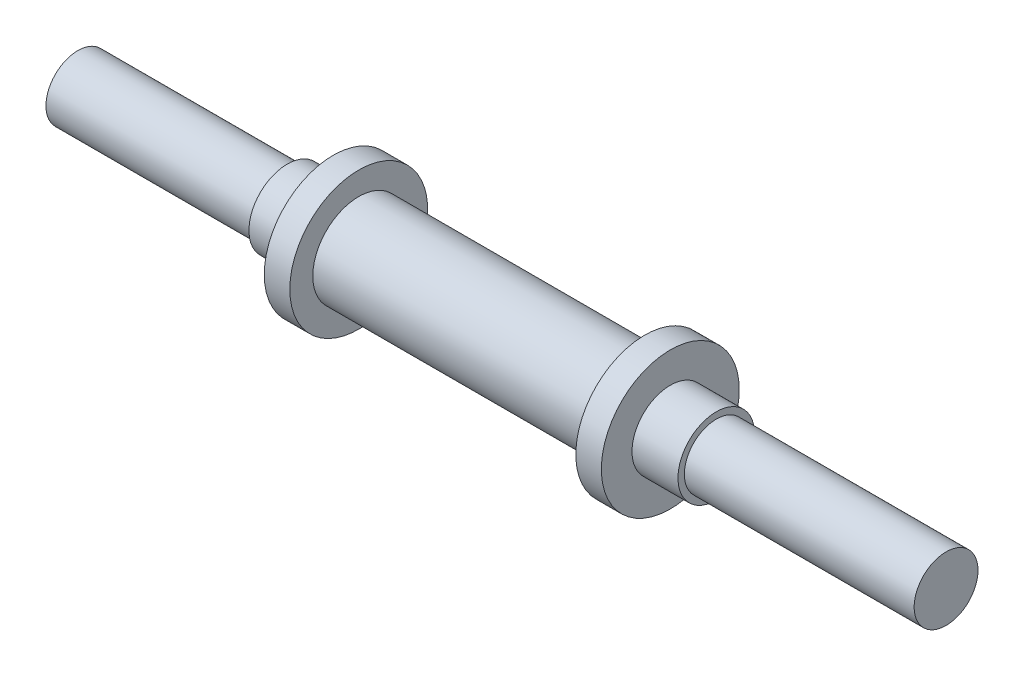
ISO-10303-21;
HEADER;
FILE_DESCRIPTION(('STEP AP214'),'2;1');
FILE_NAME('part.step','',(''),(''),'','','');
FILE_SCHEMA(('AUTOMOTIVE_DESIGN { 1 0 10303 214 1 1 1 1 }'));
ENDSEC;
DATA;
#1=APPLICATION_CONTEXT('core data for automotive mechanical design processes');
#2=APPLICATION_PROTOCOL_DEFINITION('international standard','automotive_design',2000,#1);
#3=PRODUCT_CONTEXT('',#1,'mechanical');
#4=PRODUCT('Part','Part','',(#3));
#5=PRODUCT_RELATED_PRODUCT_CATEGORY('part','',(#4));
#6=PRODUCT_DEFINITION_FORMATION('','',#4);
#7=PRODUCT_DEFINITION_CONTEXT('part definition',#1,'design');
#8=PRODUCT_DEFINITION('design','',#6,#7);
#9=PRODUCT_DEFINITION_SHAPE('','',#8);
#10=(LENGTH_UNIT() NAMED_UNIT(*) SI_UNIT(.MILLI.,.METRE.));
#11=(NAMED_UNIT(*) PLANE_ANGLE_UNIT() SI_UNIT($,.RADIAN.));
#12=(NAMED_UNIT(*) SI_UNIT($,.STERADIAN.) SOLID_ANGLE_UNIT());
#13=UNCERTAINTY_MEASURE_WITH_UNIT(LENGTH_MEASURE(1.E-05),#10,'distance_accuracy_value','');
#14=(GEOMETRIC_REPRESENTATION_CONTEXT(3) GLOBAL_UNCERTAINTY_ASSIGNED_CONTEXT((#13)) GLOBAL_UNIT_ASSIGNED_CONTEXT((#10,
#11,#12)) REPRESENTATION_CONTEXT('',''));
#15=CARTESIAN_POINT('',(0.,0.,0.));
#16=DIRECTION('',(0.,0.,1.));
#17=DIRECTION('',(1.,0.,0.));
#18=AXIS2_PLACEMENT_3D('',#15,#16,#17);
#19=CARTESIAN_POINT('',(232.,0.,0.));
#20=DIRECTION('',(-1.,0.,0.));
#21=DIRECTION('',(0.,0.,1.));
#22=AXIS2_PLACEMENT_3D('',#19,#20,#21);
#23=CYLINDRICAL_SURFACE('',#22,18.);
#24=CARTESIAN_POINT('',(110.,0.,0.));
#25=DIRECTION('',(-1.,0.,0.));
#26=DIRECTION('',(0.,0.,1.));
#27=AXIS2_PLACEMENT_3D('',#24,#25,#26);
#28=CIRCLE('',#27,18.);
#29=CARTESIAN_POINT('',(110.,0.,18.));
#30=VERTEX_POINT('',#29);
#31=EDGE_CURVE('E38',#30,#30,#28,.T.);
#32=ORIENTED_EDGE('',*,*,#31,.F.);
#33=EDGE_LOOP('',(#32));
#34=FACE_BOUND('',#33,.T.);
#35=CARTESIAN_POINT('',(222.,0.,0.));
#36=DIRECTION('',(1.,0.,0.));
#37=DIRECTION('',(0.,0.,-1.));
#38=AXIS2_PLACEMENT_3D('',#35,#36,#37);
#39=CIRCLE('',#38,18.);
#40=CARTESIAN_POINT('',(222.,0.,-18.));
#41=VERTEX_POINT('',#40);
#42=EDGE_CURVE('E10',#41,#41,#39,.T.);
#43=ORIENTED_EDGE('',*,*,#42,.F.);
#44=EDGE_LOOP('',(#43));
#45=FACE_BOUND('',#44,.T.);
#46=ADVANCED_FACE('F31',(#34,#45),#23,.T.);
#47=CARTESIAN_POINT('',(110.,0.,0.));
#48=DIRECTION('',(-1.,0.,0.));
#49=DIRECTION('',(0.,0.,1.));
#50=AXIS2_PLACEMENT_3D('',#47,#48,#49);
#51=CYLINDRICAL_SURFACE('',#50,27.);
#52=CARTESIAN_POINT('',(110.,0.,0.));
#53=DIRECTION('',(-1.,0.,0.));
#54=DIRECTION('',(0.,0.,1.));
#55=AXIS2_PLACEMENT_3D('',#52,#53,#54);
#56=CIRCLE('',#55,27.);
#57=CARTESIAN_POINT('',(110.,0.,27.));
#58=VERTEX_POINT('',#57);
#59=EDGE_CURVE('E69',#58,#58,#56,.T.);
#60=ORIENTED_EDGE('',*,*,#59,.T.);
#61=EDGE_LOOP('',(#60));
#62=FACE_BOUND('',#61,.T.);
#63=CARTESIAN_POINT('',(100.,0.,0.));
#64=DIRECTION('',(-1.,0.,0.));
#65=DIRECTION('',(0.,0.,1.));
#66=AXIS2_PLACEMENT_3D('',#63,#64,#65);
#67=CIRCLE('',#66,27.);
#68=CARTESIAN_POINT('',(100.,0.,27.));
#69=VERTEX_POINT('',#68);
#70=EDGE_CURVE('E70',#69,#69,#67,.T.);
#71=ORIENTED_EDGE('',*,*,#70,.F.);
#72=EDGE_LOOP('',(#71));
#73=FACE_BOUND('',#72,.T.);
#74=ADVANCED_FACE('F99',(#62,#73),#51,.T.);
#75=CARTESIAN_POINT('',(110.,0.,0.));
#76=DIRECTION('',(-1.,0.,0.));
#77=DIRECTION('',(0.,0.,1.));
#78=AXIS2_PLACEMENT_3D('',#75,#76,#77);
#79=PLANE('',#78);
#80=ORIENTED_EDGE('',*,*,#31,.T.);
#81=EDGE_LOOP('',(#80));
#82=FACE_BOUND('',#81,.T.);
#83=ORIENTED_EDGE('',*,*,#59,.F.);
#84=EDGE_LOOP('',(#83));
#85=FACE_BOUND('',#84,.T.);
#86=ADVANCED_FACE('F105',(#82,#85),#79,.F.);
#87=CARTESIAN_POINT('',(0.,0.,0.));
#88=DIRECTION('',(1.,0.,0.));
#89=DIRECTION('',(0.,0.,-1.));
#90=AXIS2_PLACEMENT_3D('',#87,#88,#89);
#91=PLANE('',#90);
#92=CARTESIAN_POINT('',(0.,0.,0.));
#93=DIRECTION('',(1.,0.,0.));
#94=DIRECTION('',(0.,0.,-1.));
#95=AXIS2_PLACEMENT_3D('',#92,#93,#94);
#96=CIRCLE('',#95,12.5);
#97=CARTESIAN_POINT('',(0.,0.,-12.5));
#98=VERTEX_POINT('',#97);
#99=EDGE_CURVE('E52',#98,#98,#96,.T.);
#100=ORIENTED_EDGE('',*,*,#99,.F.);
#101=EDGE_LOOP('',(#100));
#102=FACE_BOUND('',#101,.T.);
#103=ADVANCED_FACE('F119',(#102),#91,.F.);
#104=CARTESIAN_POINT('',(100.,0.,0.));
#105=DIRECTION('',(-1.,0.,0.));
#106=DIRECTION('',(0.,0.,1.));
#107=AXIS2_PLACEMENT_3D('',#104,#105,#106);
#108=CYLINDRICAL_SURFACE('',#107,12.5);
#109=ORIENTED_EDGE('',*,*,#99,.T.);
#110=EDGE_LOOP('',(#109));
#111=FACE_BOUND('',#110,.T.);
#112=CARTESIAN_POINT('',(82.,0.,0.));
#113=DIRECTION('',(1.,0.,0.));
#114=DIRECTION('',(0.,0.,-1.));
#115=AXIS2_PLACEMENT_3D('',#112,#113,#114);
#116=CIRCLE('',#115,12.5);
#117=CARTESIAN_POINT('',(82.,0.,-12.5));
#118=VERTEX_POINT('',#117);
#119=EDGE_CURVE('E49',#118,#118,#116,.T.);
#120=ORIENTED_EDGE('',*,*,#119,.F.);
#121=EDGE_LOOP('',(#120));
#122=FACE_BOUND('',#121,.T.);
#123=ADVANCED_FACE('F33',(#111,#122),#108,.T.);
#124=CARTESIAN_POINT('',(82.,0.,0.));
#125=DIRECTION('',(1.,0.,0.));
#126=DIRECTION('',(0.,0.,-1.));
#127=AXIS2_PLACEMENT_3D('',#124,#125,#126);
#128=PLANE('',#127);
#129=ORIENTED_EDGE('',*,*,#119,.T.);
#130=EDGE_LOOP('',(#129));
#131=FACE_BOUND('',#130,.T.);
#132=CARTESIAN_POINT('',(82.,0.,0.));
#133=DIRECTION('',(1.,0.,0.));
#134=DIRECTION('',(0.,0.,-1.));
#135=AXIS2_PLACEMENT_3D('',#132,#133,#134);
#136=CIRCLE('',#135,15.);
#137=CARTESIAN_POINT('',(82.,0.,-15.));
#138=VERTEX_POINT('',#137);
#139=EDGE_CURVE('E55',#138,#138,#136,.T.);
#140=ORIENTED_EDGE('',*,*,#139,.F.);
#141=EDGE_LOOP('',(#140));
#142=FACE_BOUND('',#141,.T.);
#143=ADVANCED_FACE('F112',(#131,#142),#128,.F.);
#144=CARTESIAN_POINT('',(82.,0.,0.));
#145=DIRECTION('',(1.,0.,0.));
#146=DIRECTION('',(0.,0.,-1.));
#147=AXIS2_PLACEMENT_3D('',#144,#145,#146);
#148=CYLINDRICAL_SURFACE('',#147,15.);
#149=ORIENTED_EDGE('',*,*,#139,.T.);
#150=EDGE_LOOP('',(#149));
#151=FACE_BOUND('',#150,.T.);
#152=CARTESIAN_POINT('',(100.,0.,0.));
#153=DIRECTION('',(1.,0.,0.));
#154=DIRECTION('',(0.,0.,-1.));
#155=AXIS2_PLACEMENT_3D('',#152,#153,#154);
#156=CIRCLE('',#155,15.);
#157=CARTESIAN_POINT('',(100.,0.,-15.));
#158=VERTEX_POINT('',#157);
#159=EDGE_CURVE('E56',#158,#158,#156,.T.);
#160=ORIENTED_EDGE('',*,*,#159,.F.);
#161=EDGE_LOOP('',(#160));
#162=FACE_BOUND('',#161,.T.);
#163=ADVANCED_FACE('F115',(#151,#162),#148,.T.);
#164=CARTESIAN_POINT('',(100.,0.,0.));
#165=DIRECTION('',(1.,0.,0.));
#166=DIRECTION('',(0.,0.,-1.));
#167=AXIS2_PLACEMENT_3D('',#164,#165,#166);
#168=PLANE('',#167);
#169=ORIENTED_EDGE('',*,*,#159,.T.);
#170=EDGE_LOOP('',(#169));
#171=FACE_BOUND('',#170,.T.);
#172=ORIENTED_EDGE('',*,*,#70,.T.);
#173=EDGE_LOOP('',(#172));
#174=FACE_BOUND('',#173,.T.);
#175=ADVANCED_FACE('F96',(#171,#174),#168,.F.);
#176=CARTESIAN_POINT('',(222.,0.,0.));
#177=DIRECTION('',(1.,0.,0.));
#178=DIRECTION('',(0.,0.,-1.));
#179=AXIS2_PLACEMENT_3D('',#176,#177,#178);
#180=CYLINDRICAL_SURFACE('',#179,27.);
#181=CARTESIAN_POINT('',(222.,0.,0.));
#182=DIRECTION('',(1.,0.,0.));
#183=DIRECTION('',(0.,0.,-1.));
#184=AXIS2_PLACEMENT_3D('',#181,#182,#183);
#185=CIRCLE('',#184,27.);
#186=CARTESIAN_POINT('',(222.,0.,-27.));
#187=VERTEX_POINT('',#186);
#188=EDGE_CURVE('E73',#187,#187,#185,.T.);
#189=ORIENTED_EDGE('',*,*,#188,.T.);
#190=EDGE_LOOP('',(#189));
#191=FACE_BOUND('',#190,.T.);
#192=CARTESIAN_POINT('',(232.,0.,0.));
#193=DIRECTION('',(1.,0.,0.));
#194=DIRECTION('',(0.,0.,-1.));
#195=AXIS2_PLACEMENT_3D('',#192,#193,#194);
#196=CIRCLE('',#195,27.);
#197=CARTESIAN_POINT('',(232.,0.,-27.));
#198=VERTEX_POINT('',#197);
#199=EDGE_CURVE('E76',#198,#198,#196,.T.);
#200=ORIENTED_EDGE('',*,*,#199,.F.);
#201=EDGE_LOOP('',(#200));
#202=FACE_BOUND('',#201,.T.);
#203=ADVANCED_FACE('F82',(#191,#202),#180,.T.);
#204=CARTESIAN_POINT('',(222.,0.,0.));
#205=DIRECTION('',(1.,0.,0.));
#206=DIRECTION('',(0.,0.,-1.));
#207=AXIS2_PLACEMENT_3D('',#204,#205,#206);
#208=PLANE('',#207);
#209=ORIENTED_EDGE('',*,*,#42,.T.);
#210=EDGE_LOOP('',(#209));
#211=FACE_BOUND('',#210,.T.);
#212=ORIENTED_EDGE('',*,*,#188,.F.);
#213=EDGE_LOOP('',(#212));
#214=FACE_BOUND('',#213,.T.);
#215=ADVANCED_FACE('F85',(#211,#214),#208,.F.);
#216=CARTESIAN_POINT('',(340.,0.,0.));
#217=DIRECTION('',(1.,0.,0.));
#218=DIRECTION('',(0.,0.,-1.));
#219=AXIS2_PLACEMENT_3D('',#216,#217,#218);
#220=PLANE('',#219);
#221=CARTESIAN_POINT('',(340.,0.,0.));
#222=DIRECTION('',(1.,0.,0.));
#223=DIRECTION('',(0.,0.,-1.));
#224=AXIS2_PLACEMENT_3D('',#221,#222,#223);
#225=CIRCLE('',#224,12.5);
#226=CARTESIAN_POINT('',(340.,0.,-12.5));
#227=VERTEX_POINT('',#226);
#228=EDGE_CURVE('E65',#227,#227,#225,.T.);
#229=ORIENTED_EDGE('',*,*,#228,.T.);
#230=EDGE_LOOP('',(#229));
#231=FACE_BOUND('',#230,.T.);
#232=ADVANCED_FACE('F87',(#231),#220,.T.);
#233=CARTESIAN_POINT('',(300.,0.,0.));
#234=DIRECTION('',(-1.,0.,0.));
#235=DIRECTION('',(0.,0.,1.));
#236=AXIS2_PLACEMENT_3D('',#233,#234,#235);
#237=CYLINDRICAL_SURFACE('',#236,12.5);
#238=CARTESIAN_POINT('',(250.,0.,0.));
#239=DIRECTION('',(1.,0.,0.));
#240=DIRECTION('',(0.,0.,-1.));
#241=AXIS2_PLACEMENT_3D('',#238,#239,#240);
#242=CIRCLE('',#241,12.5);
#243=CARTESIAN_POINT('',(250.,0.,-12.5));
#244=VERTEX_POINT('',#243);
#245=EDGE_CURVE('E42',#244,#244,#242,.T.);
#246=ORIENTED_EDGE('',*,*,#245,.T.);
#247=EDGE_LOOP('',(#246));
#248=FACE_BOUND('',#247,.T.);
#249=ORIENTED_EDGE('',*,*,#228,.F.);
#250=EDGE_LOOP('',(#249));
#251=FACE_BOUND('',#250,.T.);
#252=ADVANCED_FACE('F93',(#248,#251),#237,.T.);
#253=CARTESIAN_POINT('',(250.,0.,0.));
#254=DIRECTION('',(1.,0.,0.));
#255=DIRECTION('',(0.,0.,-1.));
#256=AXIS2_PLACEMENT_3D('',#253,#254,#255);
#257=PLANE('',#256);
#258=ORIENTED_EDGE('',*,*,#245,.F.);
#259=EDGE_LOOP('',(#258));
#260=FACE_BOUND('',#259,.T.);
#261=CARTESIAN_POINT('',(250.,0.,0.));
#262=DIRECTION('',(1.,0.,0.));
#263=DIRECTION('',(0.,0.,-1.));
#264=AXIS2_PLACEMENT_3D('',#261,#262,#263);
#265=CIRCLE('',#264,15.);
#266=CARTESIAN_POINT('',(250.,0.,-15.));
#267=VERTEX_POINT('',#266);
#268=EDGE_CURVE('E59',#267,#267,#265,.T.);
#269=ORIENTED_EDGE('',*,*,#268,.T.);
#270=EDGE_LOOP('',(#269));
#271=FACE_BOUND('',#270,.T.);
#272=ADVANCED_FACE('F174',(#260,#271),#257,.T.);
#273=CARTESIAN_POINT('',(250.,0.,0.));
#274=DIRECTION('',(-1.,0.,0.));
#275=DIRECTION('',(0.,0.,1.));
#276=AXIS2_PLACEMENT_3D('',#273,#274,#275);
#277=CYLINDRICAL_SURFACE('',#276,15.);
#278=ORIENTED_EDGE('',*,*,#268,.F.);
#279=EDGE_LOOP('',(#278));
#280=FACE_BOUND('',#279,.T.);
#281=CARTESIAN_POINT('',(232.,0.,0.));
#282=DIRECTION('',(1.,0.,0.));
#283=DIRECTION('',(0.,0.,-1.));
#284=AXIS2_PLACEMENT_3D('',#281,#282,#283);
#285=CIRCLE('',#284,15.);
#286=CARTESIAN_POINT('',(232.,0.,-15.));
#287=VERTEX_POINT('',#286);
#288=EDGE_CURVE('E46',#287,#287,#285,.T.);
#289=ORIENTED_EDGE('',*,*,#288,.T.);
#290=EDGE_LOOP('',(#289));
#291=FACE_BOUND('',#290,.T.);
#292=ADVANCED_FACE('F164',(#280,#291),#277,.T.);
#293=CARTESIAN_POINT('',(232.,0.,0.));
#294=DIRECTION('',(1.,0.,0.));
#295=DIRECTION('',(0.,0.,-1.));
#296=AXIS2_PLACEMENT_3D('',#293,#294,#295);
#297=PLANE('',#296);
#298=ORIENTED_EDGE('',*,*,#288,.F.);
#299=EDGE_LOOP('',(#298));
#300=FACE_BOUND('',#299,.T.);
#301=ORIENTED_EDGE('',*,*,#199,.T.);
#302=EDGE_LOOP('',(#301));
#303=FACE_BOUND('',#302,.T.);
#304=ADVANCED_FACE('F161',(#300,#303),#297,.T.);
#305=CLOSED_SHELL('',(#46,#74,#86,#103,#123,#143,#163,#175,#203,#215,#232,#252,#272,#292,#304));
#306=MANIFOLD_SOLID_BREP('B2',#305);
#307=ADVANCED_BREP_SHAPE_REPRESENTATION('',(#18,#306),#14);
#308=SHAPE_DEFINITION_REPRESENTATION(#9,#307);
ENDSEC;
END-ISO-10303-21;
